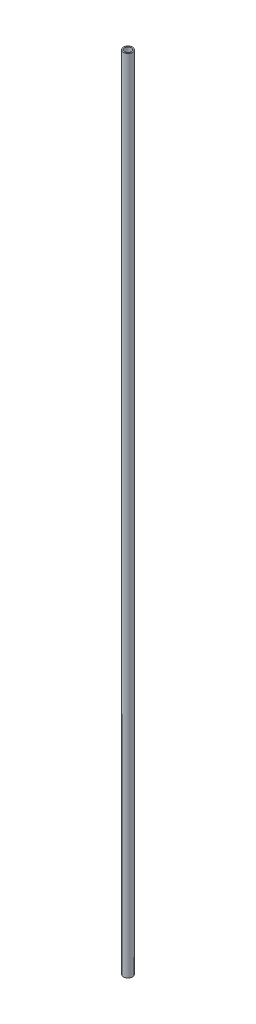
ISO-10303-21;
HEADER;
FILE_DESCRIPTION(('STEP AP214'),'2;1');
FILE_NAME('part.step','',(''),(''),'','','');
FILE_SCHEMA(('AUTOMOTIVE_DESIGN { 1 0 10303 214 1 1 1 1 }'));
ENDSEC;
DATA;
#1=APPLICATION_CONTEXT('core data for automotive mechanical design processes');
#2=APPLICATION_PROTOCOL_DEFINITION('international standard','automotive_design',2000,#1);
#3=PRODUCT_CONTEXT('',#1,'mechanical');
#4=PRODUCT('Part','Part','',(#3));
#5=PRODUCT_RELATED_PRODUCT_CATEGORY('part','',(#4));
#6=PRODUCT_DEFINITION_FORMATION('','',#4);
#7=PRODUCT_DEFINITION_CONTEXT('part definition',#1,'design');
#8=PRODUCT_DEFINITION('design','',#6,#7);
#9=PRODUCT_DEFINITION_SHAPE('','',#8);
#10=(LENGTH_UNIT() NAMED_UNIT(*) SI_UNIT(.MILLI.,.METRE.));
#11=(NAMED_UNIT(*) PLANE_ANGLE_UNIT() SI_UNIT($,.RADIAN.));
#12=(NAMED_UNIT(*) SI_UNIT($,.STERADIAN.) SOLID_ANGLE_UNIT());
#13=UNCERTAINTY_MEASURE_WITH_UNIT(LENGTH_MEASURE(1.E-05),#10,'distance_accuracy_value','');
#14=(GEOMETRIC_REPRESENTATION_CONTEXT(3) GLOBAL_UNCERTAINTY_ASSIGNED_CONTEXT((#13)) GLOBAL_UNIT_ASSIGNED_CONTEXT((#10,
#11,#12)) REPRESENTATION_CONTEXT('',''));
#15=CARTESIAN_POINT('',(0.,0.,0.));
#16=DIRECTION('',(0.,0.,1.));
#17=DIRECTION('',(1.,0.,0.));
#18=AXIS2_PLACEMENT_3D('',#15,#16,#17);
#19=CARTESIAN_POINT('',(0.,700.,0.));
#20=DIRECTION('',(0.,1.,0.));
#21=DIRECTION('',(0.,0.,1.));
#22=AXIS2_PLACEMENT_3D('',#19,#20,#21);
#23=PLANE('',#22);
#24=CARTESIAN_POINT('',(0.,700.,0.));
#25=DIRECTION('',(0.,1.,0.));
#26=DIRECTION('',(0.,0.,1.));
#27=AXIS2_PLACEMENT_3D('',#24,#25,#26);
#28=CIRCLE('',#27,4.);
#29=CARTESIAN_POINT('',(0.,700.,4.));
#30=VERTEX_POINT('',#29);
#31=EDGE_CURVE('E10',#30,#30,#28,.T.);
#32=ORIENTED_EDGE('',*,*,#31,.T.);
#33=EDGE_LOOP('',(#32));
#34=FACE_BOUND('',#33,.T.);
#35=CARTESIAN_POINT('',(0.,700.,0.));
#36=DIRECTION('',(0.,1.,0.));
#37=DIRECTION('',(0.,0.,1.));
#38=AXIS2_PLACEMENT_3D('',#35,#36,#37);
#39=CIRCLE('',#38,3.);
#40=CARTESIAN_POINT('',(0.,700.,3.));
#41=VERTEX_POINT('',#40);
#42=EDGE_CURVE('E54',#41,#41,#39,.T.);
#43=ORIENTED_EDGE('',*,*,#42,.F.);
#44=EDGE_LOOP('',(#43));
#45=FACE_BOUND('',#44,.T.);
#46=ADVANCED_FACE('F41',(#34,#45),#23,.T.);
#47=CARTESIAN_POINT('',(0.,0.,0.));
#48=DIRECTION('',(0.,1.,0.));
#49=DIRECTION('',(0.,0.,1.));
#50=AXIS2_PLACEMENT_3D('',#47,#48,#49);
#51=PLANE('',#50);
#52=CARTESIAN_POINT('',(0.,0.,0.));
#53=DIRECTION('',(0.,1.,0.));
#54=DIRECTION('',(0.,0.,1.));
#55=AXIS2_PLACEMENT_3D('',#52,#53,#54);
#56=CIRCLE('',#55,4.);
#57=CARTESIAN_POINT('',(0.,0.,4.));
#58=VERTEX_POINT('',#57);
#59=EDGE_CURVE('E45',#58,#58,#56,.T.);
#60=ORIENTED_EDGE('',*,*,#59,.F.);
#61=EDGE_LOOP('',(#60));
#62=FACE_BOUND('',#61,.T.);
#63=CARTESIAN_POINT('',(0.,0.,0.));
#64=DIRECTION('',(0.,1.,0.));
#65=DIRECTION('',(0.,0.,1.));
#66=AXIS2_PLACEMENT_3D('',#63,#64,#65);
#67=CIRCLE('',#66,3.);
#68=CARTESIAN_POINT('',(0.,0.,3.));
#69=VERTEX_POINT('',#68);
#70=EDGE_CURVE('E56',#69,#69,#67,.T.);
#71=ORIENTED_EDGE('',*,*,#70,.T.);
#72=EDGE_LOOP('',(#71));
#73=FACE_BOUND('',#72,.T.);
#74=ADVANCED_FACE('F68',(#62,#73),#51,.F.);
#75=CARTESIAN_POINT('',(0.,700.,0.));
#76=DIRECTION('',(0.,-1.,0.));
#77=DIRECTION('',(0.,0.,-1.));
#78=AXIS2_PLACEMENT_3D('',#75,#76,#77);
#79=CYLINDRICAL_SURFACE('',#78,4.);
#80=ORIENTED_EDGE('',*,*,#31,.F.);
#81=EDGE_LOOP('',(#80));
#82=FACE_BOUND('',#81,.T.);
#83=ORIENTED_EDGE('',*,*,#59,.T.);
#84=EDGE_LOOP('',(#83));
#85=FACE_BOUND('',#84,.T.);
#86=ADVANCED_FACE('F43',(#82,#85),#79,.T.);
#87=CARTESIAN_POINT('',(0.,700.,0.));
#88=DIRECTION('',(0.,-1.,0.));
#89=DIRECTION('',(0.,0.,-1.));
#90=AXIS2_PLACEMENT_3D('',#87,#88,#89);
#91=CYLINDRICAL_SURFACE('',#90,3.);
#92=ORIENTED_EDGE('',*,*,#42,.T.);
#93=EDGE_LOOP('',(#92));
#94=FACE_BOUND('',#93,.T.);
#95=ORIENTED_EDGE('',*,*,#70,.F.);
#96=EDGE_LOOP('',(#95));
#97=FACE_BOUND('',#96,.T.);
#98=ADVANCED_FACE('F64',(#94,#97),#91,.F.);
#99=CLOSED_SHELL('',(#46,#74,#86,#98));
#100=MANIFOLD_SOLID_BREP('B2',#99);
#101=ADVANCED_BREP_SHAPE_REPRESENTATION('',(#18,#100),#14);
#102=SHAPE_DEFINITION_REPRESENTATION(#9,#101);
ENDSEC;
END-ISO-10303-21;
